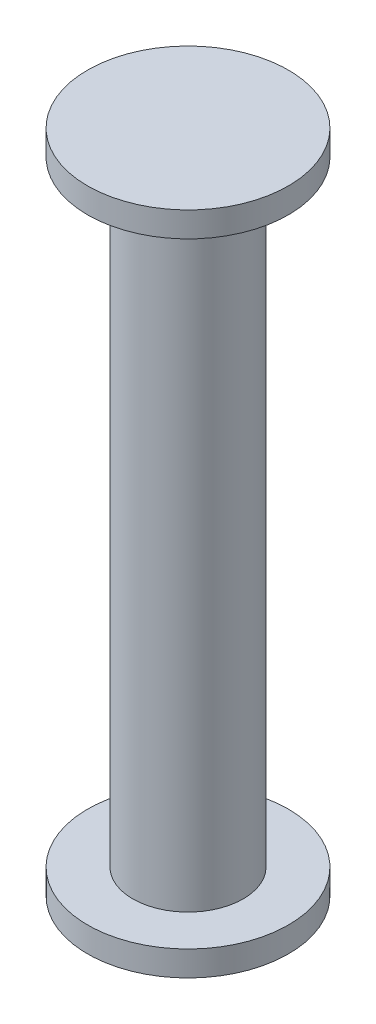
ISO-10303-21;
HEADER;
FILE_DESCRIPTION(('STEP AP214'),'2;1');
FILE_NAME('part.step','',(''),(''),'','','');
FILE_SCHEMA(('AUTOMOTIVE_DESIGN { 1 0 10303 214 1 1 1 1 }'));
ENDSEC;
DATA;
#1=APPLICATION_CONTEXT('core data for automotive mechanical design processes');
#2=APPLICATION_PROTOCOL_DEFINITION('international standard','automotive_design',2000,#1);
#3=PRODUCT_CONTEXT('',#1,'mechanical');
#4=PRODUCT('Part','Part','',(#3));
#5=PRODUCT_RELATED_PRODUCT_CATEGORY('part','',(#4));
#6=PRODUCT_DEFINITION_FORMATION('','',#4);
#7=PRODUCT_DEFINITION_CONTEXT('part definition',#1,'design');
#8=PRODUCT_DEFINITION('design','',#6,#7);
#9=PRODUCT_DEFINITION_SHAPE('','',#8);
#10=(LENGTH_UNIT() NAMED_UNIT(*) SI_UNIT(.MILLI.,.METRE.));
#11=(NAMED_UNIT(*) PLANE_ANGLE_UNIT() SI_UNIT($,.RADIAN.));
#12=(NAMED_UNIT(*) SI_UNIT($,.STERADIAN.) SOLID_ANGLE_UNIT());
#13=UNCERTAINTY_MEASURE_WITH_UNIT(LENGTH_MEASURE(1.E-05),#10,'distance_accuracy_value','');
#14=(GEOMETRIC_REPRESENTATION_CONTEXT(3) GLOBAL_UNCERTAINTY_ASSIGNED_CONTEXT((#13)) GLOBAL_UNIT_ASSIGNED_CONTEXT((#10,
#11,#12)) REPRESENTATION_CONTEXT('',''));
#15=CARTESIAN_POINT('',(0.,0.,0.));
#16=DIRECTION('',(0.,0.,1.));
#17=DIRECTION('',(1.,0.,0.));
#18=AXIS2_PLACEMENT_3D('',#15,#16,#17);
#19=CARTESIAN_POINT('',(0.,24.5,0.));
#20=DIRECTION('',(0.,-1.,0.));
#21=DIRECTION('',(0.,0.,-1.));
#22=AXIS2_PLACEMENT_3D('',#19,#20,#21);
#23=CYLINDRICAL_SURFACE('',#22,2.2);
#24=CARTESIAN_POINT('',(0.,24.5,0.));
#25=DIRECTION('',(0.,1.,0.));
#26=DIRECTION('',(0.,0.,1.));
#27=AXIS2_PLACEMENT_3D('',#24,#25,#26);
#28=CIRCLE('',#27,2.2);
#29=CARTESIAN_POINT('',(0.,24.5,2.2));
#30=VERTEX_POINT('',#29);
#31=EDGE_CURVE('E10',#30,#30,#28,.T.);
#32=ORIENTED_EDGE('',*,*,#31,.F.);
#33=EDGE_LOOP('',(#32));
#34=FACE_BOUND('',#33,.T.);
#35=CARTESIAN_POINT('',(0.,0.,0.));
#36=DIRECTION('',(0.,1.,0.));
#37=DIRECTION('',(0.,0.,1.));
#38=AXIS2_PLACEMENT_3D('',#35,#36,#37);
#39=CIRCLE('',#38,2.2);
#40=CARTESIAN_POINT('',(0.,0.,2.2));
#41=VERTEX_POINT('',#40);
#42=EDGE_CURVE('E40',#41,#41,#39,.T.);
#43=ORIENTED_EDGE('',*,*,#42,.T.);
#44=EDGE_LOOP('',(#43));
#45=FACE_BOUND('',#44,.T.);
#46=ADVANCED_FACE('F37',(#34,#45),#23,.T.);
#47=CARTESIAN_POINT('',(0.,25.5,0.));
#48=DIRECTION('',(0.,-1.,0.));
#49=DIRECTION('',(0.,0.,-1.));
#50=AXIS2_PLACEMENT_3D('',#47,#48,#49);
#51=CYLINDRICAL_SURFACE('',#50,4.);
#52=CARTESIAN_POINT('',(0.,25.5,0.));
#53=DIRECTION('',(0.,1.,0.));
#54=DIRECTION('',(0.,0.,1.));
#55=AXIS2_PLACEMENT_3D('',#52,#53,#54);
#56=CIRCLE('',#55,4.);
#57=CARTESIAN_POINT('',(0.,25.5,4.));
#58=VERTEX_POINT('',#57);
#59=EDGE_CURVE('E44',#58,#58,#56,.T.);
#60=ORIENTED_EDGE('',*,*,#59,.F.);
#61=EDGE_LOOP('',(#60));
#62=FACE_BOUND('',#61,.T.);
#63=CARTESIAN_POINT('',(0.,24.5,0.));
#64=DIRECTION('',(0.,1.,0.));
#65=DIRECTION('',(0.,0.,1.));
#66=AXIS2_PLACEMENT_3D('',#63,#64,#65);
#67=CIRCLE('',#66,4.);
#68=CARTESIAN_POINT('',(0.,24.5,4.));
#69=VERTEX_POINT('',#68);
#70=EDGE_CURVE('E48',#69,#69,#67,.T.);
#71=ORIENTED_EDGE('',*,*,#70,.T.);
#72=EDGE_LOOP('',(#71));
#73=FACE_BOUND('',#72,.T.);
#74=ADVANCED_FACE('F85',(#62,#73),#51,.T.);
#75=CARTESIAN_POINT('',(0.,25.5,0.));
#76=DIRECTION('',(0.,1.,0.));
#77=DIRECTION('',(0.,0.,1.));
#78=AXIS2_PLACEMENT_3D('',#75,#76,#77);
#79=PLANE('',#78);
#80=ORIENTED_EDGE('',*,*,#59,.T.);
#81=EDGE_LOOP('',(#80));
#82=FACE_BOUND('',#81,.T.);
#83=ADVANCED_FACE('F81',(#82),#79,.T.);
#84=CARTESIAN_POINT('',(0.,24.5,0.));
#85=DIRECTION('',(0.,1.,0.));
#86=DIRECTION('',(0.,0.,1.));
#87=AXIS2_PLACEMENT_3D('',#84,#85,#86);
#88=PLANE('',#87);
#89=ORIENTED_EDGE('',*,*,#31,.T.);
#90=EDGE_LOOP('',(#89));
#91=FACE_BOUND('',#90,.T.);
#92=ORIENTED_EDGE('',*,*,#70,.F.);
#93=EDGE_LOOP('',(#92));
#94=FACE_BOUND('',#93,.T.);
#95=ADVANCED_FACE('F73',(#91,#94),#88,.F.);
#96=CARTESIAN_POINT('',(0.,-1.,0.));
#97=DIRECTION('',(0.,1.,0.));
#98=DIRECTION('',(0.,0.,1.));
#99=AXIS2_PLACEMENT_3D('',#96,#97,#98);
#100=CYLINDRICAL_SURFACE('',#99,4.);
#101=CARTESIAN_POINT('',(0.,-1.,0.));
#102=DIRECTION('',(0.,-1.,0.));
#103=DIRECTION('',(0.,0.,-1.));
#104=AXIS2_PLACEMENT_3D('',#101,#102,#103);
#105=CIRCLE('',#104,4.);
#106=CARTESIAN_POINT('',(0.,-1.,-4.));
#107=VERTEX_POINT('',#106);
#108=EDGE_CURVE('E56',#107,#107,#105,.T.);
#109=ORIENTED_EDGE('',*,*,#108,.F.);
#110=EDGE_LOOP('',(#109));
#111=FACE_BOUND('',#110,.T.);
#112=CARTESIAN_POINT('',(0.,0.,0.));
#113=DIRECTION('',(0.,-1.,0.));
#114=DIRECTION('',(0.,0.,-1.));
#115=AXIS2_PLACEMENT_3D('',#112,#113,#114);
#116=CIRCLE('',#115,4.);
#117=CARTESIAN_POINT('',(0.,0.,-4.));
#118=VERTEX_POINT('',#117);
#119=EDGE_CURVE('E53',#118,#118,#116,.T.);
#120=ORIENTED_EDGE('',*,*,#119,.T.);
#121=EDGE_LOOP('',(#120));
#122=FACE_BOUND('',#121,.T.);
#123=ADVANCED_FACE('F71',(#111,#122),#100,.T.);
#124=CARTESIAN_POINT('',(0.,-1.,0.));
#125=DIRECTION('',(0.,-1.,0.));
#126=DIRECTION('',(0.,0.,-1.));
#127=AXIS2_PLACEMENT_3D('',#124,#125,#126);
#128=PLANE('',#127);
#129=ORIENTED_EDGE('',*,*,#108,.T.);
#130=EDGE_LOOP('',(#129));
#131=FACE_BOUND('',#130,.T.);
#132=ADVANCED_FACE('F67',(#131),#128,.T.);
#133=CARTESIAN_POINT('',(0.,0.,0.));
#134=DIRECTION('',(0.,-1.,0.));
#135=DIRECTION('',(0.,0.,-1.));
#136=AXIS2_PLACEMENT_3D('',#133,#134,#135);
#137=PLANE('',#136);
#138=ORIENTED_EDGE('',*,*,#42,.F.);
#139=EDGE_LOOP('',(#138));
#140=FACE_BOUND('',#139,.T.);
#141=ORIENTED_EDGE('',*,*,#119,.F.);
#142=EDGE_LOOP('',(#141));
#143=FACE_BOUND('',#142,.T.);
#144=ADVANCED_FACE('F64',(#140,#143),#137,.F.);
#145=CLOSED_SHELL('',(#46,#74,#83,#95,#123,#132,#144));
#146=MANIFOLD_SOLID_BREP('B2',#145);
#147=ADVANCED_BREP_SHAPE_REPRESENTATION('',(#18,#146),#14);
#148=SHAPE_DEFINITION_REPRESENTATION(#9,#147);
ENDSEC;
END-ISO-10303-21;
